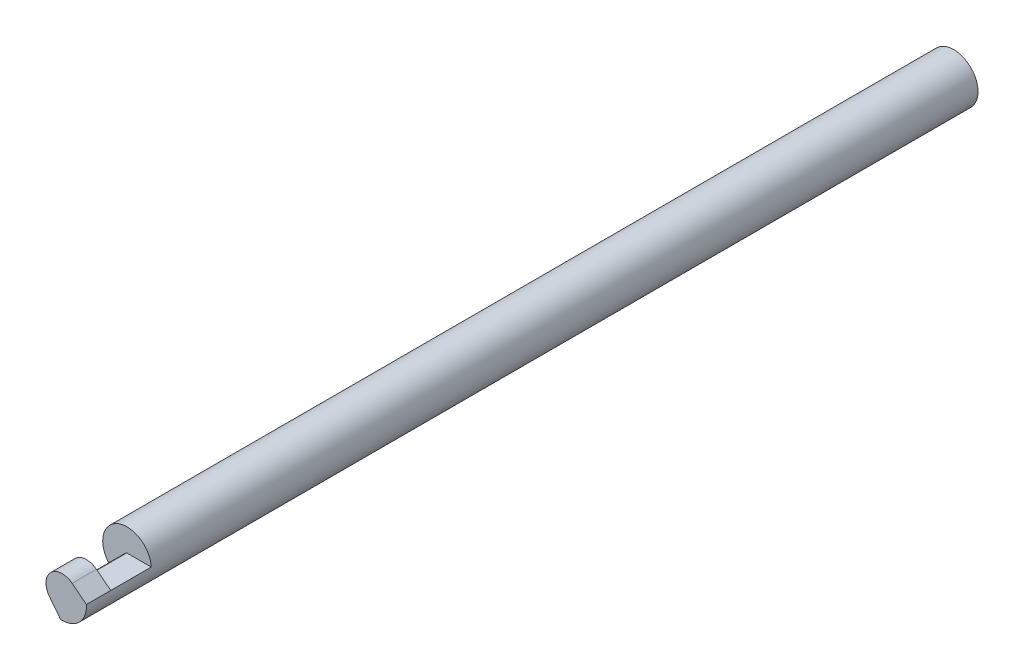
ISO-10303-21;
HEADER;
FILE_DESCRIPTION(('STEP AP214'),'2;1');
FILE_NAME('part.step','',(''),(''),'','','');
FILE_SCHEMA(('AUTOMOTIVE_DESIGN { 1 0 10303 214 1 1 1 1 }'));
ENDSEC;
DATA;
#1=APPLICATION_CONTEXT('core data for automotive mechanical design processes');
#2=APPLICATION_PROTOCOL_DEFINITION('international standard','automotive_design',2000,#1);
#3=PRODUCT_CONTEXT('',#1,'mechanical');
#4=PRODUCT('Part','Part','',(#3));
#5=PRODUCT_RELATED_PRODUCT_CATEGORY('part','',(#4));
#6=PRODUCT_DEFINITION_FORMATION('','',#4);
#7=PRODUCT_DEFINITION_CONTEXT('part definition',#1,'design');
#8=PRODUCT_DEFINITION('design','',#6,#7);
#9=PRODUCT_DEFINITION_SHAPE('','',#8);
#10=(LENGTH_UNIT() NAMED_UNIT(*) SI_UNIT(.MILLI.,.METRE.));
#11=(NAMED_UNIT(*) PLANE_ANGLE_UNIT() SI_UNIT($,.RADIAN.));
#12=(NAMED_UNIT(*) SI_UNIT($,.STERADIAN.) SOLID_ANGLE_UNIT());
#13=UNCERTAINTY_MEASURE_WITH_UNIT(LENGTH_MEASURE(1.E-05),#10,'distance_accuracy_value','');
#14=(GEOMETRIC_REPRESENTATION_CONTEXT(3) GLOBAL_UNCERTAINTY_ASSIGNED_CONTEXT((#13)) GLOBAL_UNIT_ASSIGNED_CONTEXT((#10,
#11,#12)) REPRESENTATION_CONTEXT('',''));
#15=CARTESIAN_POINT('',(0.,0.,0.));
#16=DIRECTION('',(0.,0.,1.));
#17=DIRECTION('',(1.,0.,0.));
#18=AXIS2_PLACEMENT_3D('',#15,#16,#17);
#19=CARTESIAN_POINT('',(0.,0.,9.84099465255125));
#20=DIRECTION('',(0.,0.,1.));
#21=DIRECTION('',(0.,-1.,0.));
#22=AXIS2_PLACEMENT_3D('',#19,#20,#21);
#23=CYLINDRICAL_SURFACE('',#22,1.5);
#24=CARTESIAN_POINT('',(0.,0.,-55.));
#25=DIRECTION('',(0.,0.,1.));
#26=DIRECTION('',(0.,-1.,0.));
#27=AXIS2_PLACEMENT_3D('',#24,#25,#26);
#28=CIRCLE('',#27,1.5);
#29=CARTESIAN_POINT('',(0.,-1.5,-55.));
#30=VERTEX_POINT('',#29);
#31=EDGE_CURVE('E49',#30,#30,#28,.T.);
#32=ORIENTED_EDGE('',*,*,#31,.T.);
#33=EDGE_LOOP('',(#32));
#34=FACE_BOUND('',#33,.T.);
#35=DIRECTION('',(0.,0.,1.));
#36=VECTOR('',#35,1.);
#37=CARTESIAN_POINT('',(1.49666295470958,0.1,-4.));
#38=LINE('',#37,#36);
#39=CARTESIAN_POINT('',(1.49666295470958,0.1,-4.));
#40=VERTEX_POINT('',#39);
#41=CARTESIAN_POINT('',(1.49666295470958,0.1,-1.5));
#42=VERTEX_POINT('',#41);
#43=EDGE_CURVE('E140',#40,#42,#38,.T.);
#44=ORIENTED_EDGE('',*,*,#43,.T.);
#45=DIRECTION('',(0.,0.,1.));
#46=VECTOR('',#45,1.);
#47=CARTESIAN_POINT('',(1.49666295470958,0.1,-5.73792139241132));
#48=LINE('',#47,#46);
#49=CARTESIAN_POINT('',(1.49666295470958,0.1,0.));
#50=VERTEX_POINT('',#49);
#51=EDGE_CURVE('E138',#42,#50,#48,.T.);
#52=ORIENTED_EDGE('',*,*,#51,.T.);
#53=CARTESIAN_POINT('',(0.,0.,0.));
#54=DIRECTION('',(0.,0.,1.));
#55=DIRECTION('',(0.,-1.,0.));
#56=AXIS2_PLACEMENT_3D('',#53,#54,#55);
#57=CIRCLE('',#56,1.5);
#58=CARTESIAN_POINT('',(-0.0999999999999999,-1.49666295470958,0.));
#59=VERTEX_POINT('',#58);
#60=EDGE_CURVE('E11',#59,#50,#57,.T.);
#61=ORIENTED_EDGE('',*,*,#60,.F.);
#62=DIRECTION('',(0.,0.,1.));
#63=VECTOR('',#62,1.);
#64=CARTESIAN_POINT('',(-0.0999999999999999,-1.49666295470958,-5.73792139241132));
#65=LINE('',#64,#63);
#66=CARTESIAN_POINT('',(-0.1,-1.49666295470958,-1.5));
#67=VERTEX_POINT('',#66);
#68=EDGE_CURVE('E116',#67,#59,#65,.T.);
#69=ORIENTED_EDGE('',*,*,#68,.F.);
#70=DIRECTION('',(0.,0.,1.));
#71=VECTOR('',#70,1.);
#72=CARTESIAN_POINT('',(-0.0999999999999999,-1.49666295470958,-4.));
#73=LINE('',#72,#71);
#74=CARTESIAN_POINT('',(-0.0999999999999999,-1.49666295470958,-4.));
#75=VERTEX_POINT('',#74);
#76=EDGE_CURVE('E186',#75,#67,#73,.T.);
#77=ORIENTED_EDGE('',*,*,#76,.F.);
#78=CARTESIAN_POINT('',(0.,0.,-4.));
#79=DIRECTION('',(0.,0.,1.));
#80=DIRECTION('',(1.,0.,0.));
#81=AXIS2_PLACEMENT_3D('',#78,#79,#80);
#82=CIRCLE('',#81,1.5);
#83=EDGE_CURVE('E170',#40,#75,#82,.T.);
#84=ORIENTED_EDGE('',*,*,#83,.F.);
#85=EDGE_LOOP('',(#44,#52,#61,#69,#77,#84));
#86=FACE_BOUND('',#85,.T.);
#87=ADVANCED_FACE('F40',(#34,#86),#23,.T.);
#88=CARTESIAN_POINT('',(0.,0.,0.));
#89=DIRECTION('',(0.,0.,-1.));
#90=DIRECTION('',(0.,1.,0.));
#91=AXIS2_PLACEMENT_3D('',#88,#89,#90);
#92=PLANE('',#91);
#93=ORIENTED_EDGE('',*,*,#60,.T.);
#94=DIRECTION('',(0.788142245808067,-0.615493135926483,0.));
#95=VECTOR('',#94,1.);
#96=CARTESIAN_POINT('',(1.49666295470958,0.1,0.));
#97=LINE('',#96,#95);
#98=CARTESIAN_POINT('',(0.615493135926483,0.788142245808067,0.));
#99=VERTEX_POINT('',#98);
#100=EDGE_CURVE('E128',#99,#50,#97,.T.);
#101=ORIENTED_EDGE('',*,*,#100,.F.);
#102=CARTESIAN_POINT('',(0.,0.,0.));
#103=DIRECTION('',(0.,0.,-1.));
#104=DIRECTION('',(1.,0.,0.));
#105=AXIS2_PLACEMENT_3D('',#102,#103,#104);
#106=CIRCLE('',#105,1.);
#107=CARTESIAN_POINT('',(-0.788142245808067,-0.615493135926483,0.));
#108=VERTEX_POINT('',#107);
#109=EDGE_CURVE('E133',#108,#99,#106,.T.);
#110=ORIENTED_EDGE('',*,*,#109,.F.);
#111=DIRECTION('',(-0.615493135926483,0.788142245808067,0.));
#112=VECTOR('',#111,1.);
#113=CARTESIAN_POINT('',(-0.0999999999999999,-1.49666295470958,0.));
#114=LINE('',#113,#112);
#115=EDGE_CURVE('E119',#59,#108,#114,.T.);
#116=ORIENTED_EDGE('',*,*,#115,.F.);
#117=EDGE_LOOP('',(#93,#101,#110,#116));
#118=FACE_BOUND('',#117,.T.);
#119=ADVANCED_FACE('F42',(#118),#92,.F.);
#120=CARTESIAN_POINT('',(0.,1.5,-55.));
#121=DIRECTION('',(0.,0.,1.));
#122=DIRECTION('',(0.,-1.,0.));
#123=AXIS2_PLACEMENT_3D('',#120,#121,#122);
#124=PLANE('',#123);
#125=ORIENTED_EDGE('',*,*,#31,.F.);
#126=EDGE_LOOP('',(#125));
#127=FACE_BOUND('',#126,.T.);
#128=ADVANCED_FACE('F198',(#127),#124,.F.);
#129=CARTESIAN_POINT('',(0.,0.,-4.));
#130=DIRECTION('',(0.,0.,1.));
#131=DIRECTION('',(1.,0.,0.));
#132=AXIS2_PLACEMENT_3D('',#129,#130,#131);
#133=CYLINDRICAL_SURFACE('',#132,0.1);
#134=CARTESIAN_POINT('',(0.,0.,-1.5));
#135=DIRECTION('',(0.,0.,-1.));
#136=DIRECTION('',(1.,0.,0.));
#137=AXIS2_PLACEMENT_3D('',#134,#135,#136);
#138=CIRCLE('',#137,0.1);
#139=CARTESIAN_POINT('',(-0.1,0.,-1.5));
#140=VERTEX_POINT('',#139);
#141=CARTESIAN_POINT('',(0.,0.1,-1.5));
#142=VERTEX_POINT('',#141);
#143=EDGE_CURVE('E160',#140,#142,#138,.T.);
#144=ORIENTED_EDGE('',*,*,#143,.T.);
#145=DIRECTION('',(0.,0.,1.));
#146=VECTOR('',#145,1.);
#147=CARTESIAN_POINT('',(0.,0.1,-4.));
#148=LINE('',#147,#146);
#149=CARTESIAN_POINT('',(0.,0.1,-4.));
#150=VERTEX_POINT('',#149);
#151=EDGE_CURVE('E89',#150,#142,#148,.T.);
#152=ORIENTED_EDGE('',*,*,#151,.F.);
#153=CARTESIAN_POINT('',(0.,0.,-4.));
#154=DIRECTION('',(0.,0.,-1.));
#155=DIRECTION('',(1.,0.,0.));
#156=AXIS2_PLACEMENT_3D('',#153,#154,#155);
#157=CIRCLE('',#156,0.1);
#158=CARTESIAN_POINT('',(-0.1,0.,-4.));
#159=VERTEX_POINT('',#158);
#160=EDGE_CURVE('E161',#159,#150,#157,.T.);
#161=ORIENTED_EDGE('',*,*,#160,.F.);
#162=DIRECTION('',(0.,0.,1.));
#163=VECTOR('',#162,1.);
#164=CARTESIAN_POINT('',(-0.1,0.,-4.));
#165=LINE('',#164,#163);
#166=EDGE_CURVE('E68',#159,#140,#165,.T.);
#167=ORIENTED_EDGE('',*,*,#166,.T.);
#168=EDGE_LOOP('',(#144,#152,#161,#167));
#169=FACE_BOUND('',#168,.T.);
#170=ADVANCED_FACE('F200',(#169),#133,.T.);
#171=CARTESIAN_POINT('',(-0.1,0.,-4.));
#172=DIRECTION('',(1.,0.,0.));
#173=DIRECTION('',(0.,1.,0.));
#174=AXIS2_PLACEMENT_3D('',#171,#172,#173);
#175=PLANE('',#174);
#176=DIRECTION('',(0.,1.,0.));
#177=VECTOR('',#176,1.);
#178=CARTESIAN_POINT('',(-0.1,0.,-1.5));
#179=LINE('',#178,#177);
#180=EDGE_CURVE('E166',#67,#140,#179,.T.);
#181=ORIENTED_EDGE('',*,*,#180,.T.);
#182=ORIENTED_EDGE('',*,*,#166,.F.);
#183=DIRECTION('',(0.,1.,0.));
#184=VECTOR('',#183,1.);
#185=CARTESIAN_POINT('',(-0.1,0.,-4.));
#186=LINE('',#185,#184);
#187=EDGE_CURVE('E173',#75,#159,#186,.T.);
#188=ORIENTED_EDGE('',*,*,#187,.F.);
#189=ORIENTED_EDGE('',*,*,#76,.T.);
#190=EDGE_LOOP('',(#181,#182,#188,#189));
#191=FACE_BOUND('',#190,.T.);
#192=ADVANCED_FACE('F206',(#191),#175,.F.);
#193=CARTESIAN_POINT('',(0.,0.1,-4.));
#194=DIRECTION('',(0.,-1.,0.));
#195=DIRECTION('',(0.,0.,-1.));
#196=AXIS2_PLACEMENT_3D('',#193,#194,#195);
#197=PLANE('',#196);
#198=DIRECTION('',(1.,0.,0.));
#199=VECTOR('',#198,1.);
#200=CARTESIAN_POINT('',(0.,0.1,-1.5));
#201=LINE('',#200,#199);
#202=EDGE_CURVE('E179',#142,#42,#201,.T.);
#203=ORIENTED_EDGE('',*,*,#202,.T.);
#204=ORIENTED_EDGE('',*,*,#43,.F.);
#205=DIRECTION('',(1.,0.,0.));
#206=VECTOR('',#205,1.);
#207=CARTESIAN_POINT('',(0.,0.1,-4.));
#208=LINE('',#207,#206);
#209=EDGE_CURVE('E165',#150,#40,#208,.T.);
#210=ORIENTED_EDGE('',*,*,#209,.F.);
#211=ORIENTED_EDGE('',*,*,#151,.T.);
#212=EDGE_LOOP('',(#203,#204,#210,#211));
#213=FACE_BOUND('',#212,.T.);
#214=ADVANCED_FACE('F226',(#213),#197,.F.);
#215=CARTESIAN_POINT('',(0.,0.,-4.));
#216=DIRECTION('',(0.,0.,1.));
#217=DIRECTION('',(1.,0.,0.));
#218=AXIS2_PLACEMENT_3D('',#215,#216,#217);
#219=PLANE('',#218);
#220=ORIENTED_EDGE('',*,*,#160,.T.);
#221=ORIENTED_EDGE('',*,*,#209,.T.);
#222=ORIENTED_EDGE('',*,*,#83,.T.);
#223=ORIENTED_EDGE('',*,*,#187,.T.);
#224=EDGE_LOOP('',(#220,#221,#222,#223));
#225=FACE_BOUND('',#224,.T.);
#226=ADVANCED_FACE('F236',(#225),#219,.T.);
#227=CARTESIAN_POINT('',(0.,0.,-1.5));
#228=DIRECTION('',(0.,0.,1.));
#229=DIRECTION('',(1.,0.,0.));
#230=AXIS2_PLACEMENT_3D('',#227,#228,#229);
#231=PLANE('',#230);
#232=CARTESIAN_POINT('',(0.,0.,-1.5));
#233=DIRECTION('',(0.,0.,1.));
#234=DIRECTION('',(1.,0.,0.));
#235=AXIS2_PLACEMENT_3D('',#232,#233,#234);
#236=CIRCLE('',#235,1.);
#237=CARTESIAN_POINT('',(0.615493135926483,0.788142245808067,-1.5));
#238=VERTEX_POINT('',#237);
#239=CARTESIAN_POINT('',(-0.788142245808067,-0.615493135926483,-1.5));
#240=VERTEX_POINT('',#239);
#241=EDGE_CURVE('E144',#238,#240,#236,.T.);
#242=ORIENTED_EDGE('',*,*,#241,.F.);
#243=DIRECTION('',(-0.788142245808067,0.615493135926483,0.));
#244=VECTOR('',#243,1.);
#245=CARTESIAN_POINT('',(1.49666295470958,0.1,-1.5));
#246=LINE('',#245,#244);
#247=EDGE_CURVE('E150',#42,#238,#246,.T.);
#248=ORIENTED_EDGE('',*,*,#247,.F.);
#249=ORIENTED_EDGE('',*,*,#202,.F.);
#250=ORIENTED_EDGE('',*,*,#143,.F.);
#251=ORIENTED_EDGE('',*,*,#180,.F.);
#252=DIRECTION('',(0.615493135926483,-0.788142245808067,0.));
#253=VECTOR('',#252,1.);
#254=CARTESIAN_POINT('',(-0.0999999999999999,-1.49666295470958,-1.5));
#255=LINE('',#254,#253);
#256=EDGE_CURVE('E122',#240,#67,#255,.T.);
#257=ORIENTED_EDGE('',*,*,#256,.F.);
#258=EDGE_LOOP('',(#242,#248,#249,#250,#251,#257));
#259=FACE_BOUND('',#258,.T.);
#260=ADVANCED_FACE('F244',(#259),#231,.F.);
#261=CARTESIAN_POINT('',(1.49666295470958,0.1,-5.73792139241132));
#262=DIRECTION('',(-0.615493135926483,-0.788142245808067,0.));
#263=DIRECTION('',(0.788142245808067,-0.615493135926483,0.));
#264=AXIS2_PLACEMENT_3D('',#261,#262,#263);
#265=PLANE('',#264);
#266=ORIENTED_EDGE('',*,*,#247,.T.);
#267=DIRECTION('',(0.,0.,1.));
#268=VECTOR('',#267,1.);
#269=CARTESIAN_POINT('',(0.615493135926483,0.788142245808067,-5.73792139241132));
#270=LINE('',#269,#268);
#271=EDGE_CURVE('E145',#238,#99,#270,.T.);
#272=ORIENTED_EDGE('',*,*,#271,.T.);
#273=ORIENTED_EDGE('',*,*,#100,.T.);
#274=ORIENTED_EDGE('',*,*,#51,.F.);
#275=EDGE_LOOP('',(#266,#272,#273,#274));
#276=FACE_BOUND('',#275,.T.);
#277=ADVANCED_FACE('F249',(#276),#265,.F.);
#278=CARTESIAN_POINT('',(0.,0.,-5.73792139241132));
#279=DIRECTION('',(0.,0.,1.));
#280=DIRECTION('',(1.,0.,0.));
#281=AXIS2_PLACEMENT_3D('',#278,#279,#280);
#282=CYLINDRICAL_SURFACE('',#281,1.);
#283=ORIENTED_EDGE('',*,*,#241,.T.);
#284=DIRECTION('',(0.,0.,1.));
#285=VECTOR('',#284,1.);
#286=CARTESIAN_POINT('',(-0.788142245808067,-0.615493135926483,-5.73792139241132));
#287=LINE('',#286,#285);
#288=EDGE_CURVE('E56',#240,#108,#287,.T.);
#289=ORIENTED_EDGE('',*,*,#288,.T.);
#290=ORIENTED_EDGE('',*,*,#109,.T.);
#291=ORIENTED_EDGE('',*,*,#271,.F.);
#292=EDGE_LOOP('',(#283,#289,#290,#291));
#293=FACE_BOUND('',#292,.T.);
#294=ADVANCED_FACE('F259',(#293),#282,.T.);
#295=CARTESIAN_POINT('',(-0.0999999999999999,-1.49666295470958,-5.73792139241132));
#296=DIRECTION('',(0.788142245808067,0.615493135926483,0.));
#297=DIRECTION('',(-0.615493135926483,0.788142245808067,0.));
#298=AXIS2_PLACEMENT_3D('',#295,#296,#297);
#299=PLANE('',#298);
#300=ORIENTED_EDGE('',*,*,#256,.T.);
#301=ORIENTED_EDGE('',*,*,#68,.T.);
#302=ORIENTED_EDGE('',*,*,#115,.T.);
#303=ORIENTED_EDGE('',*,*,#288,.F.);
#304=EDGE_LOOP('',(#300,#301,#302,#303));
#305=FACE_BOUND('',#304,.T.);
#306=ADVANCED_FACE('F118',(#305),#299,.F.);
#307=CLOSED_SHELL('',(#87,#119,#128,#170,#192,#214,#226,#260,#277,#294,#306));
#308=MANIFOLD_SOLID_BREP('B2',#307);
#309=ADVANCED_BREP_SHAPE_REPRESENTATION('',(#18,#308),#14);
#310=SHAPE_DEFINITION_REPRESENTATION(#9,#309);
ENDSEC;
END-ISO-10303-21;
